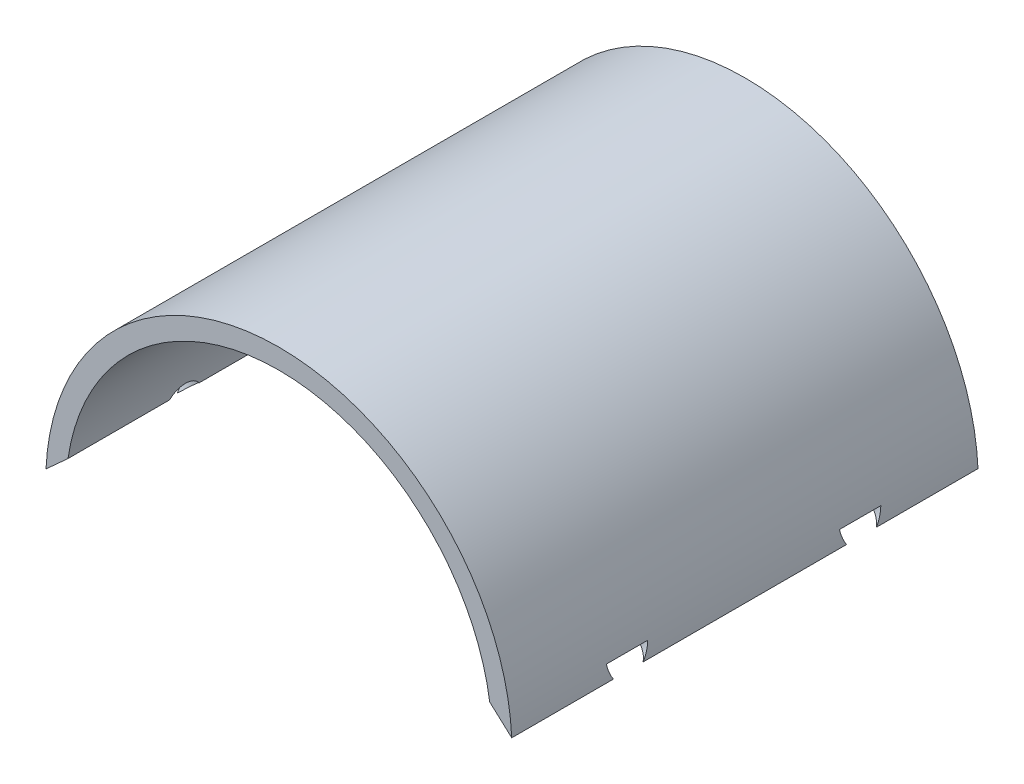
ISO-10303-21;
HEADER;
FILE_DESCRIPTION(('STEP AP214'),'2;1');
FILE_NAME('part.step','',(''),(''),'','','');
FILE_SCHEMA(('AUTOMOTIVE_DESIGN { 1 0 10303 214 1 1 1 1 }'));
ENDSEC;
DATA;
#1=APPLICATION_CONTEXT('core data for automotive mechanical design processes');
#2=APPLICATION_PROTOCOL_DEFINITION('international standard','automotive_design',2000,#1);
#3=PRODUCT_CONTEXT('',#1,'mechanical');
#4=PRODUCT('Part','Part','',(#3));
#5=PRODUCT_RELATED_PRODUCT_CATEGORY('part','',(#4));
#6=PRODUCT_DEFINITION_FORMATION('','',#4);
#7=PRODUCT_DEFINITION_CONTEXT('part definition',#1,'design');
#8=PRODUCT_DEFINITION('design','',#6,#7);
#9=PRODUCT_DEFINITION_SHAPE('','',#8);
#10=(LENGTH_UNIT() NAMED_UNIT(*) SI_UNIT(.MILLI.,.METRE.));
#11=(NAMED_UNIT(*) PLANE_ANGLE_UNIT() SI_UNIT($,.RADIAN.));
#12=(NAMED_UNIT(*) SI_UNIT($,.STERADIAN.) SOLID_ANGLE_UNIT());
#13=UNCERTAINTY_MEASURE_WITH_UNIT(LENGTH_MEASURE(1.E-05),#10,'distance_accuracy_value','');
#14=(GEOMETRIC_REPRESENTATION_CONTEXT(3) GLOBAL_UNCERTAINTY_ASSIGNED_CONTEXT((#13)) GLOBAL_UNIT_ASSIGNED_CONTEXT((#10,
#11,#12)) REPRESENTATION_CONTEXT('',''));
#15=CARTESIAN_POINT('',(0.,0.,0.));
#16=DIRECTION('',(0.,0.,1.));
#17=DIRECTION('',(1.,0.,0.));
#18=AXIS2_PLACEMENT_3D('',#15,#16,#17);
#19=CARTESIAN_POINT('',(40.2038837694651,5.93778829627168,88.9));
#20=DIRECTION('',(0.672307408747508,0.740272077106257,0.));
#21=DIRECTION('',(-0.740272077106257,0.672307408747508,0.));
#22=AXIS2_PLACEMENT_3D('',#19,#20,#21);
#23=PLANE('',#22);
#24=DIRECTION('',(0.,0.,-1.));
#25=VECTOR('',#24,1.);
#26=CARTESIAN_POINT('',(40.2038837694651,5.93778829627168,88.9));
#27=LINE('',#26,#25);
#28=CARTESIAN_POINT('',(40.2038837694651,5.93778829627168,63.8516801787405));
#29=VERTEX_POINT('',#28);
#30=CARTESIAN_POINT('',(40.2038837694651,5.93778829627168,25.0483198212595));
#31=VERTEX_POINT('',#30);
#32=EDGE_CURVE('E176',#29,#31,#27,.T.);
#33=ORIENTED_EDGE('',*,*,#32,.T.);
#34=CARTESIAN_POINT('',(42.3014633715025,4.03278829627168,22.225));
#35=DIRECTION('',(-0.672307408747508,-0.740272077106257,0.));
#36=DIRECTION('',(-0.740272077106257,0.672307408747508,0.));
#37=AXIS2_PLACEMENT_3D('',#34,#35,#36);
#38=CIRCLE('',#37,4.00000000000002);
#39=CARTESIAN_POINT('',(44.39904297354,2.12778829627168,25.0483198212595));
#40=VERTEX_POINT('',#39);
#41=EDGE_CURVE('E158',#40,#31,#38,.T.);
#42=ORIENTED_EDGE('',*,*,#41,.F.);
#43=DIRECTION('',(0.,0.,-1.));
#44=VECTOR('',#43,1.);
#45=CARTESIAN_POINT('',(44.39904297354,2.12778829627168,88.9));
#46=LINE('',#45,#44);
#47=CARTESIAN_POINT('',(44.39904297354,2.12778829627168,63.8516801787405));
#48=VERTEX_POINT('',#47);
#49=EDGE_CURVE('E181',#48,#40,#46,.T.);
#50=ORIENTED_EDGE('',*,*,#49,.F.);
#51=CARTESIAN_POINT('',(42.3014633715025,4.03278829627168,66.675));
#52=DIRECTION('',(-0.672307408747508,-0.740272077106257,0.));
#53=DIRECTION('',(0.740272077106257,-0.672307408747508,0.));
#54=AXIS2_PLACEMENT_3D('',#51,#52,#53);
#55=CIRCLE('',#54,4.00000000000002);
#56=EDGE_CURVE('E163',#29,#48,#55,.T.);
#57=ORIENTED_EDGE('',*,*,#56,.F.);
#58=EDGE_LOOP('',(#33,#42,#50,#57));
#59=FACE_BOUND('',#58,.T.);
#60=ADVANCED_FACE('F35',(#59),#23,.F.);
#61=CARTESIAN_POINT('',(40.2038837694651,5.93778829627168,88.9));
#62=VERTEX_POINT('',#61);
#63=CARTESIAN_POINT('',(40.2038837694651,5.93778829627168,69.4983198212595));
#64=VERTEX_POINT('',#63);
#65=EDGE_CURVE('E179',#62,#64,#27,.T.);
#66=ORIENTED_EDGE('',*,*,#65,.T.);
#67=CARTESIAN_POINT('',(44.39904297354,2.12778829627168,69.4983198212595));
#68=VERTEX_POINT('',#67);
#69=EDGE_CURVE('E241',#68,#64,#55,.T.);
#70=ORIENTED_EDGE('',*,*,#69,.F.);
#71=CARTESIAN_POINT('',(44.39904297354,2.12778829627168,88.9));
#72=VERTEX_POINT('',#71);
#73=EDGE_CURVE('E177',#72,#68,#46,.T.);
#74=ORIENTED_EDGE('',*,*,#73,.F.);
#75=DIRECTION('',(0.740272077106257,-0.672307408747507,0.));
#76=VECTOR('',#75,1.);
#77=CARTESIAN_POINT('',(40.2038837694651,5.93778829627168,88.9));
#78=LINE('',#77,#76);
#79=EDGE_CURVE('E306',#62,#72,#78,.T.);
#80=ORIENTED_EDGE('',*,*,#79,.F.);
#81=EDGE_LOOP('',(#66,#70,#74,#80));
#82=FACE_BOUND('',#81,.T.);
#83=ADVANCED_FACE('F353',(#82),#23,.F.);
#84=CARTESIAN_POINT('',(-40.2038837694651,5.93778829627168,88.9));
#85=DIRECTION('',(-0.672307408747508,0.740272077106257,0.));
#86=DIRECTION('',(-0.740272077106257,-0.672307408747508,0.));
#87=AXIS2_PLACEMENT_3D('',#84,#85,#86);
#88=PLANE('',#87);
#89=DIRECTION('',(0.,0.,-1.));
#90=VECTOR('',#89,1.);
#91=CARTESIAN_POINT('',(-44.39904297354,2.12778829627168,88.9));
#92=LINE('',#91,#90);
#93=CARTESIAN_POINT('',(-44.39904297354,2.12778829627168,63.9039892151859));
#94=VERTEX_POINT('',#93);
#95=CARTESIAN_POINT('',(-44.39904297354,2.12778829627168,24.9960107848141));
#96=VERTEX_POINT('',#95);
#97=EDGE_CURVE('E329',#94,#96,#92,.T.);
#98=ORIENTED_EDGE('',*,*,#97,.T.);
#99=CARTESIAN_POINT('',(-42.3014633715025,4.03278829627168,22.1726909635546));
#100=DIRECTION('',(-0.672307408747508,0.740272077106257,0.));
#101=DIRECTION('',(-0.740272077106257,-0.672307408747508,0.));
#102=AXIS2_PLACEMENT_3D('',#99,#100,#101);
#103=CIRCLE('',#102,4.);
#104=CARTESIAN_POINT('',(-40.2038837694651,5.93778829627168,24.9960107848141));
#105=VERTEX_POINT('',#104);
#106=EDGE_CURVE('E195',#96,#105,#103,.T.);
#107=ORIENTED_EDGE('',*,*,#106,.T.);
#108=DIRECTION('',(0.,0.,-1.));
#109=VECTOR('',#108,1.);
#110=CARTESIAN_POINT('',(-40.2038837694651,5.93778829627168,88.9));
#111=LINE('',#110,#109);
#112=CARTESIAN_POINT('',(-40.2038837694651,5.93778829627168,63.9039892151859));
#113=VERTEX_POINT('',#112);
#114=EDGE_CURVE('E326',#113,#105,#111,.T.);
#115=ORIENTED_EDGE('',*,*,#114,.F.);
#116=CARTESIAN_POINT('',(-42.3014633715025,4.03278829627168,66.7273090364454));
#117=DIRECTION('',(-0.672307408747508,0.740272077106257,0.));
#118=DIRECTION('',(-0.740272077106257,-0.672307408747508,0.));
#119=AXIS2_PLACEMENT_3D('',#116,#117,#118);
#120=CIRCLE('',#119,4.);
#121=EDGE_CURVE('E185',#113,#94,#120,.T.);
#122=ORIENTED_EDGE('',*,*,#121,.T.);
#123=EDGE_LOOP('',(#98,#107,#115,#122));
#124=FACE_BOUND('',#123,.T.);
#125=ADVANCED_FACE('F358',(#124),#88,.F.);
#126=CARTESIAN_POINT('',(-44.39904297354,2.12778829627168,88.9));
#127=VERTEX_POINT('',#126);
#128=CARTESIAN_POINT('',(-44.39904297354,2.12778829627168,69.5506288577048));
#129=VERTEX_POINT('',#128);
#130=EDGE_CURVE('E327',#127,#129,#92,.T.);
#131=ORIENTED_EDGE('',*,*,#130,.T.);
#132=CARTESIAN_POINT('',(-42.3014633715025,4.03278829627168,66.7273090364454));
#133=DIRECTION('',(0.672307408747508,-0.740272077106257,0.));
#134=DIRECTION('',(0.740272077106257,0.672307408747508,0.));
#135=AXIS2_PLACEMENT_3D('',#132,#133,#134);
#136=CIRCLE('',#135,4.);
#137=CARTESIAN_POINT('',(-40.2038837694651,5.93778829627168,69.5506288577048));
#138=VERTEX_POINT('',#137);
#139=EDGE_CURVE('E272',#138,#129,#136,.T.);
#140=ORIENTED_EDGE('',*,*,#139,.F.);
#141=CARTESIAN_POINT('',(-40.2038837694651,5.93778829627168,88.9));
#142=VERTEX_POINT('',#141);
#143=EDGE_CURVE('E322',#142,#138,#111,.T.);
#144=ORIENTED_EDGE('',*,*,#143,.F.);
#145=DIRECTION('',(0.740272077106257,0.672307408747507,0.));
#146=VECTOR('',#145,1.);
#147=CARTESIAN_POINT('',(-40.2038837694651,5.93778829627168,88.9));
#148=LINE('',#147,#146);
#149=EDGE_CURVE('E311',#127,#142,#148,.T.);
#150=ORIENTED_EDGE('',*,*,#149,.F.);
#151=EDGE_LOOP('',(#131,#140,#144,#150));
#152=FACE_BOUND('',#151,.T.);
#153=ADVANCED_FACE('F364',(#152),#88,.F.);
#154=CARTESIAN_POINT('',(0.,0.,88.9));
#155=DIRECTION('',(0.,0.,-1.));
#156=DIRECTION('',(-1.,0.,0.));
#157=AXIS2_PLACEMENT_3D('',#154,#155,#156);
#158=CYLINDRICAL_SURFACE('',#157,40.64);
#159=CARTESIAN_POINT('',(40.2038837694651,5.93778829627168,19.4016801787405));
#160=VERTEX_POINT('',#159);
#161=CARTESIAN_POINT('',(40.2038837694651,5.93778829627168,0.));
#162=VERTEX_POINT('',#161);
#163=EDGE_CURVE('E169',#160,#162,#27,.T.);
#164=ORIENTED_EDGE('',*,*,#163,.F.);
#165=CARTESIAN_POINT('',(40.2038837694651,5.93778829627168,19.4016801787405));
#166=CARTESIAN_POINT('',(40.1913132421633,6.02291585990194,19.468451012384));
#167=CARTESIAN_POINT('',(40.1788118055654,6.10567612462734,19.5383090284334));
#168=CARTESIAN_POINT('',(40.1541531544196,6.26578865022538,19.6841564919255));
#169=CARTESIAN_POINT('',(40.141996254572,6.34313605606763,19.7601513154342));
#170=CARTESIAN_POINT('',(40.1181724615959,6.49211688683358,19.9186650040298));
#171=CARTESIAN_POINT('',(40.1065096054522,6.56370640806694,20.0012259066478));
#172=CARTESIAN_POINT('',(40.084010278307,6.69973661307581,20.1721383550985));
#173=CARTESIAN_POINT('',(40.0731736749685,6.76417844241918,20.2604889693869));
#174=CARTESIAN_POINT('',(40.0525137129598,6.88545967671023,20.4431581372088));
#175=CARTESIAN_POINT('',(40.0426967734591,6.94225151658456,20.5375091010737));
#176=CARTESIAN_POINT('',(40.0244097045485,7.04691787405929,20.7311039358884));
#177=CARTESIAN_POINT('',(40.0159388212325,7.09479738591596,20.8303450268524));
#178=CARTESIAN_POINT('',(40.0005991194072,7.18077811889623,21.0327622636441));
#179=CARTESIAN_POINT('',(39.9937256904317,7.21890751291721,21.1359260593821));
#180=CARTESIAN_POINT('',(39.9817585070471,7.28489638060097,21.3455846116719));
#181=CARTESIAN_POINT('',(39.9766644580635,7.31275755419963,21.4520788136948));
#182=CARTESIAN_POINT('',(39.9688951209998,7.3550954287587,21.6549319276881));
#183=CARTESIAN_POINT('',(39.9660082465001,7.37074734269621,21.751038760085));
#184=CARTESIAN_POINT('',(39.9618273423075,7.39338141912511,21.9442982070598));
#185=CARTESIAN_POINT('',(39.9605331676218,7.40036437080399,22.0414507256303));
#186=CARTESIAN_POINT('',(39.959572741404,7.40554902528821,22.2360426896164));
#187=CARTESIAN_POINT('',(39.9599071437956,7.4037472007363,22.3334822345852));
#188=CARTESIAN_POINT('',(39.9621931505267,7.39139675083092,22.5277577855384));
#189=CARTESIAN_POINT('',(39.9641446988048,7.3808484286908,22.6245938123276));
#190=CARTESIAN_POINT('',(39.9719414920248,7.33855241593989,22.8983064206819));
#191=CARTESIAN_POINT('',(39.9796837595757,7.29642130763879,23.0736312666679));
#192=CARTESIAN_POINT('',(39.999871326816,7.18491731329966,23.4148936292307));
#193=CARTESIAN_POINT('',(40.0123158095611,7.11554915923653,23.5808327706885));
#194=CARTESIAN_POINT('',(40.0415424936381,6.94923599022486,23.9068167729333));
#195=CARTESIAN_POINT('',(40.0584870977926,6.85124076692096,24.0663081757797));
#196=CARTESIAN_POINT('',(40.095192960951,6.63304538763831,24.3689532611373));
#197=CARTESIAN_POINT('',(40.1149555090133,6.51283506194859,24.5120994123058));
#198=CARTESIAN_POINT('',(40.1465702815048,6.31406979300915,24.7186060183779));
#199=CARTESIAN_POINT('',(40.1578673895727,6.24187114155978,24.7883169061829));
#200=CARTESIAN_POINT('',(40.1807169493678,6.09304946759938,24.9223146031002));
#201=CARTESIAN_POINT('',(40.1922684964993,6.01644092130682,24.9866176253914));
#202=CARTESIAN_POINT('',(40.2038837694651,5.93778829627168,25.0483198212595));
#203=B_SPLINE_CURVE_WITH_KNOTS('',3,(#165,#166,#167,#168,#169,#170,#171,#172,#173,#174,#175,
#176,#177,#178,#179,#180,#181,#182,#183,#184,#185,#186,#187,#188,#189,#190,#191,#192,#193,#194,
#195,#196,#197,#198,#199,#200,#201,#202),.UNSPECIFIED.,.F.,.F.,(4,2,2,2,2,2,2,2,2,2,2,2,2,2,2,2,
2,2,4),(0.,0.326735220214414,0.653759843865197,0.983079210473244,1.312345720231,
1.64357330309618,1.97461471142325,2.30468848457326,2.63470758840894,2.92656284759356,
3.21839153549948,3.51033741122768,3.80227316654106,4.34104349743154,4.87972026749843,
5.4413775079196,6.00329250565088,6.30606558674257,6.60789591837461),.UNSPECIFIED.);
#204=EDGE_CURVE('E153',#160,#31,#203,.T.);
#205=ORIENTED_EDGE('',*,*,#204,.T.);
#206=ORIENTED_EDGE('',*,*,#32,.F.);
#207=CARTESIAN_POINT('',(40.2038837694651,5.93778829627168,63.8516801787405));
#208=CARTESIAN_POINT('',(40.1913132421633,6.02291585990194,63.918451012384));
#209=CARTESIAN_POINT('',(40.1788118055654,6.10567612462734,63.9883090284334));
#210=CARTESIAN_POINT('',(40.1541531544196,6.26578865022537,64.1341564919255));
#211=CARTESIAN_POINT('',(40.141996254572,6.34313605606762,64.2101513154342));
#212=CARTESIAN_POINT('',(40.1181724615959,6.49211688683357,64.3686650040298));
#213=CARTESIAN_POINT('',(40.1065096054522,6.56370640806694,64.4512259066478));
#214=CARTESIAN_POINT('',(40.084010278307,6.69973661307581,64.6221383550985));
#215=CARTESIAN_POINT('',(40.0731736749685,6.76417844241919,64.7104889693869));
#216=CARTESIAN_POINT('',(40.0525137129598,6.88545967671023,64.8931581372088));
#217=CARTESIAN_POINT('',(40.0426967734591,6.94225151658456,64.9875091010737));
#218=CARTESIAN_POINT('',(40.0244097045485,7.04691787405928,65.1811039358884));
#219=CARTESIAN_POINT('',(40.0159388212325,7.09479738591596,65.2803450268524));
#220=CARTESIAN_POINT('',(40.0005991194072,7.18077811889623,65.4827622636441));
#221=CARTESIAN_POINT('',(39.9937256904317,7.21890751291721,65.5859260593821));
#222=CARTESIAN_POINT('',(39.9817585070471,7.28489638060096,65.7955846116719));
#223=CARTESIAN_POINT('',(39.9766644580635,7.31275755419963,65.9020788136948));
#224=CARTESIAN_POINT('',(39.9688951209998,7.3550954287587,66.1049319276881));
#225=CARTESIAN_POINT('',(39.9660082465001,7.37074734269622,66.201038760085));
#226=CARTESIAN_POINT('',(39.9618273423075,7.39338141912512,66.3942982070598));
#227=CARTESIAN_POINT('',(39.9605331676218,7.40036437080399,66.4914507256303));
#228=CARTESIAN_POINT('',(39.959572741404,7.40554902528821,66.6860426896164));
#229=CARTESIAN_POINT('',(39.9599071437956,7.4037472007363,66.7834822345852));
#230=CARTESIAN_POINT('',(39.9621931505267,7.39139675083092,66.9777577855384));
#231=CARTESIAN_POINT('',(39.9641446988048,7.38084842869079,67.0745938123277));
#232=CARTESIAN_POINT('',(39.9719414920248,7.33855241593988,67.3483064206819));
#233=CARTESIAN_POINT('',(39.9796837595757,7.29642130763878,67.523631266668));
#234=CARTESIAN_POINT('',(39.999871326816,7.18491731329965,67.8648936292307));
#235=CARTESIAN_POINT('',(40.0123158095611,7.11554915923653,68.0308327706885));
#236=CARTESIAN_POINT('',(40.0415424936381,6.94923599022486,68.3568167729333));
#237=CARTESIAN_POINT('',(40.0584870977926,6.85124076692096,68.5163081757797));
#238=CARTESIAN_POINT('',(40.095192960951,6.6330453876383,68.8189532611374));
#239=CARTESIAN_POINT('',(40.1149555090133,6.51283506194858,68.9620994123058));
#240=CARTESIAN_POINT('',(40.1465702815048,6.31406979300913,69.1686060183779));
#241=CARTESIAN_POINT('',(40.1578673895727,6.24187114155976,69.2383169061829));
#242=CARTESIAN_POINT('',(40.1807169493678,6.09304946759937,69.3723146031002));
#243=CARTESIAN_POINT('',(40.1922684964993,6.01644092130681,69.4366176253914));
#244=CARTESIAN_POINT('',(40.2038837694651,5.93778829627167,69.4983198212595));
#245=B_SPLINE_CURVE_WITH_KNOTS('',3,(#207,#208,#209,#210,#211,#212,#213,#214,#215,#216,#217,
#218,#219,#220,#221,#222,#223,#224,#225,#226,#227,#228,#229,#230,#231,#232,#233,#234,#235,#236,
#237,#238,#239,#240,#241,#242,#243,#244),.UNSPECIFIED.,.F.,.F.,(4,2,2,2,2,2,2,2,2,2,2,2,2,2,2,2,
2,2,4),(0.,0.326735220214408,0.653759843865195,0.983079210473237,1.312345720231,
1.64357330309617,1.97461471142324,2.30468848457324,2.63470758840896,2.92656284759356,
3.21839153549949,3.51033741122769,3.80227316654107,4.34104349743155,4.87972026749843,
5.4413775079196,6.0032925056509,6.30606558674258,6.60789591837461),.UNSPECIFIED.);
#246=EDGE_CURVE('E233',#29,#64,#245,.T.);
#247=ORIENTED_EDGE('',*,*,#246,.T.);
#248=ORIENTED_EDGE('',*,*,#65,.F.);
#249=CARTESIAN_POINT('',(0.,0.,88.9));
#250=DIRECTION('',(0.,0.,-1.));
#251=DIRECTION('',(1.,0.,0.));
#252=AXIS2_PLACEMENT_3D('',#249,#250,#251);
#253=CIRCLE('',#252,40.64);
#254=EDGE_CURVE('E303',#142,#62,#253,.T.);
#255=ORIENTED_EDGE('',*,*,#254,.F.);
#256=ORIENTED_EDGE('',*,*,#143,.T.);
#257=CARTESIAN_POINT('',(-40.2038837694651,5.93778829627166,69.5506288577048));
#258=CARTESIAN_POINT('',(-40.1913132421633,6.02291585990194,69.4838580240613));
#259=CARTESIAN_POINT('',(-40.1788118055654,6.10567612462734,69.4140000080119));
#260=CARTESIAN_POINT('',(-40.1541531544196,6.26578865022537,69.2681525445199));
#261=CARTESIAN_POINT('',(-40.141996254572,6.34313605606761,69.1921577210112));
#262=CARTESIAN_POINT('',(-40.1181724615959,6.49211688683356,69.0336440324156));
#263=CARTESIAN_POINT('',(-40.1065096054522,6.56370640806692,68.9510831297976));
#264=CARTESIAN_POINT('',(-40.084010278307,6.69973661307579,68.7801706813469));
#265=CARTESIAN_POINT('',(-40.0731736749685,6.76417844241917,68.6918200670584));
#266=CARTESIAN_POINT('',(-40.0525137129598,6.88545967671022,68.5091508992366));
#267=CARTESIAN_POINT('',(-40.0426967734591,6.94225151658455,68.4147999353717));
#268=CARTESIAN_POINT('',(-40.0244097045485,7.04691787405928,68.221205100557));
#269=CARTESIAN_POINT('',(-40.0159388212325,7.09479738591595,68.121964009593));
#270=CARTESIAN_POINT('',(-40.0005991194072,7.18077811889622,67.9195467728013));
#271=CARTESIAN_POINT('',(-39.9937256904317,7.2189075129172,67.8163829770633));
#272=CARTESIAN_POINT('',(-39.9817585070471,7.28489638060095,67.6067244247735));
#273=CARTESIAN_POINT('',(-39.9766644580635,7.31275755419961,67.5002302227506));
#274=CARTESIAN_POINT('',(-39.9688951209998,7.35509542875868,67.2973771087573));
#275=CARTESIAN_POINT('',(-39.9660082465001,7.3707473426962,67.2012702763604));
#276=CARTESIAN_POINT('',(-39.9618273423075,7.3933814191251,67.0080108293856));
#277=CARTESIAN_POINT('',(-39.9605331676218,7.40036437080397,66.9108583108151));
#278=CARTESIAN_POINT('',(-39.959572741404,7.40554902528819,66.716266346829));
#279=CARTESIAN_POINT('',(-39.9599071437956,7.40374720073629,66.6188268018602));
#280=CARTESIAN_POINT('',(-39.9621931505267,7.39139675083091,66.424551250907));
#281=CARTESIAN_POINT('',(-39.9641446988048,7.38084842869078,66.3277152241177));
#282=CARTESIAN_POINT('',(-39.9719414920248,7.33855241593987,66.0540026157635));
#283=CARTESIAN_POINT('',(-39.9796837595757,7.29642130763877,65.8786777697774));
#284=CARTESIAN_POINT('',(-39.999871326816,7.18491731329965,65.5374154072147));
#285=CARTESIAN_POINT('',(-40.0123158095611,7.11554915923653,65.3714762657569));
#286=CARTESIAN_POINT('',(-40.0415424936381,6.94923599022486,65.0454922635121));
#287=CARTESIAN_POINT('',(-40.0584870977926,6.85124076692097,64.8860008606657));
#288=CARTESIAN_POINT('',(-40.095192960951,6.63304538763831,64.583355775308));
#289=CARTESIAN_POINT('',(-40.1149555090133,6.51283506194859,64.4402096241396));
#290=CARTESIAN_POINT('',(-40.1465702815048,6.31406979300914,64.2337030180675));
#291=CARTESIAN_POINT('',(-40.1578673895727,6.24187114155978,64.1639921302625));
#292=CARTESIAN_POINT('',(-40.1807169493678,6.09304946759938,64.0299944333452));
#293=CARTESIAN_POINT('',(-40.1922684964993,6.01644092130682,63.965691411054));
#294=CARTESIAN_POINT('',(-40.2038837694651,5.93778829627166,63.9039892151859));
#295=B_SPLINE_CURVE_WITH_KNOTS('',3,(#257,#258,#259,#260,#261,#262,#263,#264,#265,#266,#267,
#268,#269,#270,#271,#272,#273,#274,#275,#276,#277,#278,#279,#280,#281,#282,#283,#284,#285,#286,
#287,#288,#289,#290,#291,#292,#293,#294),.UNSPECIFIED.,.F.,.F.,(4,2,2,2,2,2,2,2,2,2,2,2,2,2,2,2,
2,2,4),(0.,0.326735220214416,0.653759843865198,0.98307921047324,1.31234572023099,
1.64357330309618,1.97461471142324,2.30468848457323,2.63470758840892,2.92656284759353,
3.21839153549945,3.51033741122765,3.80227316654103,4.34104349743152,4.87972026749839,
5.44137750791956,6.00329250565084,6.30606558674255,6.60789591837459),.UNSPECIFIED.);
#296=EDGE_CURVE('E297',#138,#113,#295,.T.);
#297=ORIENTED_EDGE('',*,*,#296,.T.);
#298=ORIENTED_EDGE('',*,*,#114,.T.);
#299=CARTESIAN_POINT('',(-40.2038837694651,5.93778829627167,24.9960107848141));
#300=CARTESIAN_POINT('',(-40.1913132421633,6.02291585990193,24.9292399511706));
#301=CARTESIAN_POINT('',(-40.1788118055654,6.10567612462733,24.8593819351212));
#302=CARTESIAN_POINT('',(-40.1541531544196,6.26578865022536,24.7135344716291));
#303=CARTESIAN_POINT('',(-40.141996254572,6.34313605606761,24.6375396481204));
#304=CARTESIAN_POINT('',(-40.1181724615959,6.49211688683356,24.4790259595248));
#305=CARTESIAN_POINT('',(-40.1065096054522,6.56370640806693,24.3964650569068));
#306=CARTESIAN_POINT('',(-40.084010278307,6.6997366130758,24.2255526084561));
#307=CARTESIAN_POINT('',(-40.0731736749685,6.76417844241917,24.1372019941677));
#308=CARTESIAN_POINT('',(-40.0525137129598,6.88545967671022,23.9545328263458));
#309=CARTESIAN_POINT('',(-40.0426967734591,6.94225151658455,23.860181862481));
#310=CARTESIAN_POINT('',(-40.0244097045485,7.04691787405927,23.6665870276663));
#311=CARTESIAN_POINT('',(-40.0159388212325,7.09479738591595,23.5673459367022));
#312=CARTESIAN_POINT('',(-40.0005991194072,7.18077811889622,23.3649286999105));
#313=CARTESIAN_POINT('',(-39.9937256904317,7.2189075129172,23.2617649041725));
#314=CARTESIAN_POINT('',(-39.9817585070471,7.28489638060095,23.0521063518827));
#315=CARTESIAN_POINT('',(-39.9766644580635,7.31275755419961,22.9456121498598));
#316=CARTESIAN_POINT('',(-39.9688951209998,7.35509542875868,22.7427590358665));
#317=CARTESIAN_POINT('',(-39.9660082465001,7.3707473426962,22.6466522034696));
#318=CARTESIAN_POINT('',(-39.9618273423075,7.3933814191251,22.4533927564949));
#319=CARTESIAN_POINT('',(-39.9605331676218,7.40036437080397,22.3562402379243));
#320=CARTESIAN_POINT('',(-39.959572741404,7.40554902528819,22.1616482739382));
#321=CARTESIAN_POINT('',(-39.9599071437956,7.40374720073629,22.0642087289694));
#322=CARTESIAN_POINT('',(-39.9621931505267,7.39139675083091,21.8699331780162));
#323=CARTESIAN_POINT('',(-39.9641446988048,7.38084842869078,21.773097151227));
#324=CARTESIAN_POINT('',(-39.9719414920248,7.33855241593987,21.4993845428728));
#325=CARTESIAN_POINT('',(-39.9796837595757,7.29642130763877,21.3240596968867));
#326=CARTESIAN_POINT('',(-39.999871326816,7.18491731329965,20.9827973343239));
#327=CARTESIAN_POINT('',(-40.0123158095611,7.11554915923652,20.8168581928662));
#328=CARTESIAN_POINT('',(-40.0415424936381,6.94923599022484,20.4908741906213));
#329=CARTESIAN_POINT('',(-40.0584870977926,6.85124076692095,20.3313827877749));
#330=CARTESIAN_POINT('',(-40.095192960951,6.6330453876383,20.0287377024173));
#331=CARTESIAN_POINT('',(-40.1149555090133,6.51283506194858,19.8855915512489));
#332=CARTESIAN_POINT('',(-40.1465702815048,6.31406979300913,19.6790849451767));
#333=CARTESIAN_POINT('',(-40.1578673895727,6.24187114155977,19.6093740573717));
#334=CARTESIAN_POINT('',(-40.1807169493678,6.09304946759937,19.4753763604544));
#335=CARTESIAN_POINT('',(-40.1922684964993,6.01644092130681,19.4110733381632));
#336=CARTESIAN_POINT('',(-40.2038837694651,5.93778829627166,19.3493711422952));
#337=B_SPLINE_CURVE_WITH_KNOTS('',3,(#299,#300,#301,#302,#303,#304,#305,#306,#307,#308,#309,
#310,#311,#312,#313,#314,#315,#316,#317,#318,#319,#320,#321,#322,#323,#324,#325,#326,#327,#328,
#329,#330,#331,#332,#333,#334,#335,#336),.UNSPECIFIED.,.F.,.F.,(4,2,2,2,2,2,2,2,2,2,2,2,2,2,2,2,
2,2,4),(0.,0.326735220214417,0.653759843865197,0.983079210473244,1.312345720231,
1.64357330309617,1.97461471142325,2.30468848457325,2.63470758840894,2.92656284759354,
3.21839153549947,3.51033741122767,3.80227316654105,4.34104349743153,4.87972026749841,
5.44137750791958,6.00329250565085,6.30606558674255,6.6078959183746),.UNSPECIFIED.);
#338=CARTESIAN_POINT('',(-40.2038837694651,5.93778829627168,19.3493711422952));
#339=VERTEX_POINT('',#338);
#340=EDGE_CURVE('E266',#105,#339,#337,.T.);
#341=ORIENTED_EDGE('',*,*,#340,.T.);
#342=CARTESIAN_POINT('',(-40.2038837694651,5.93778829627168,0.));
#343=VERTEX_POINT('',#342);
#344=EDGE_CURVE('E313',#339,#343,#111,.T.);
#345=ORIENTED_EDGE('',*,*,#344,.T.);
#346=CARTESIAN_POINT('',(0.,0.,0.));
#347=DIRECTION('',(0.,0.,-1.));
#348=DIRECTION('',(1.,0.,0.));
#349=AXIS2_PLACEMENT_3D('',#346,#347,#348);
#350=CIRCLE('',#349,40.64);
#351=EDGE_CURVE('E175',#343,#162,#350,.T.);
#352=ORIENTED_EDGE('',*,*,#351,.T.);
#353=EDGE_LOOP('',(#164,#205,#206,#247,#248,#255,#256,#297,#298,#341,#345,#352));
#354=FACE_BOUND('',#353,.T.);
#355=ADVANCED_FACE('F37',(#354),#158,.F.);
#356=CARTESIAN_POINT('',(44.39904297354,2.12778829627168,19.4016801787405));
#357=VERTEX_POINT('',#356);
#358=CARTESIAN_POINT('',(44.39904297354,2.12778829627168,0.));
#359=VERTEX_POINT('',#358);
#360=EDGE_CURVE('E171',#357,#359,#46,.T.);
#361=ORIENTED_EDGE('',*,*,#360,.F.);
#362=EDGE_CURVE('E156',#160,#357,#38,.T.);
#363=ORIENTED_EDGE('',*,*,#362,.F.);
#364=ORIENTED_EDGE('',*,*,#163,.T.);
#365=DIRECTION('',(0.740272077106257,-0.672307408747507,0.));
#366=VECTOR('',#365,1.);
#367=CARTESIAN_POINT('',(40.2038837694651,5.93778829627168,0.));
#368=LINE('',#367,#366);
#369=EDGE_CURVE('E315',#162,#359,#368,.T.);
#370=ORIENTED_EDGE('',*,*,#369,.T.);
#371=EDGE_LOOP('',(#361,#363,#364,#370));
#372=FACE_BOUND('',#371,.T.);
#373=ADVANCED_FACE('F167',(#372),#23,.F.);
#374=CARTESIAN_POINT('',(0.,0.,88.9));
#375=DIRECTION('',(0.,0.,-1.));
#376=DIRECTION('',(-1.,0.,0.));
#377=AXIS2_PLACEMENT_3D('',#374,#375,#376);
#378=CYLINDRICAL_SURFACE('',#377,44.45);
#379=DIRECTION('',(0.,0.,-1.));
#380=VECTOR('',#379,1.);
#381=CARTESIAN_POINT('',(44.1628902552898,5.0439691017319,88.9));
#382=LINE('',#381,#380);
#383=CARTESIAN_POINT('',(44.1628902552898,5.0439691017319,26.1636042369071));
#384=VERTEX_POINT('',#383);
#385=CARTESIAN_POINT('',(44.1628902552898,5.0439691017319,18.2863957630929));
#386=VERTEX_POINT('',#385);
#387=EDGE_CURVE('E467',#384,#386,#382,.T.);
#388=ORIENTED_EDGE('',*,*,#387,.T.);
#389=CARTESIAN_POINT('',(44.1628902552898,5.0439691017319,18.2863957630928));
#390=CARTESIAN_POINT('',(44.1820882207202,4.87594230518133,18.3089589502951));
#391=CARTESIAN_POINT('',(44.2002218425883,4.70860522803788,18.3376143365309));
#392=CARTESIAN_POINT('',(44.2343731536034,4.37612964124248,18.4070658009129));
#393=CARTESIAN_POINT('',(44.2503893669069,4.21099273646198,18.447870283281));
#394=CARTESIAN_POINT('',(44.2800115624876,3.88703907732059,18.5406662679598));
#395=CARTESIAN_POINT('',(44.2936571173332,3.72816187528309,18.5924335879432));
#396=CARTESIAN_POINT('',(44.3189313479414,3.41460828009221,18.7076300748707));
#397=CARTESIAN_POINT('',(44.330560895291,3.25993009608054,18.7710541776434));
#398=CARTESIAN_POINT('',(44.3531677738895,2.93737590671437,18.9181843089747));
#399=CARTESIAN_POINT('',(44.363895738379,2.77016886967958,19.0034161147886));
#400=CARTESIAN_POINT('',(44.3783028882209,2.52498528170084,19.1432161995369));
#401=CARTESIAN_POINT('',(44.3828439396484,2.44378091214641,19.1920991618397));
#402=CARTESIAN_POINT('',(44.3913614431513,2.28384625817868,19.2938688486936));
#403=CARTESIAN_POINT('',(44.3953376652043,2.20511699183728,19.3467571910389));
#404=CARTESIAN_POINT('',(44.39904297354,2.12778829627168,19.4016801787405));
#405=B_SPLINE_CURVE_WITH_KNOTS('',3,(#389,#390,#391,#392,#393,#394,#395,#396,#397,#398,#399,
#400,#401,#402,#403,#404),.UNSPECIFIED.,.F.,.F.,(4,2,2,2,2,2,2,4),(0.,0.511752184475264,
1.0238592028553,1.52636097799275,2.02864496014023,2.59173143963583,2.87630157654165,
3.16098727221963),.UNSPECIFIED.);
#406=EDGE_CURVE('E11',#386,#357,#405,.T.);
#407=ORIENTED_EDGE('',*,*,#406,.T.);
#408=ORIENTED_EDGE('',*,*,#360,.T.);
#409=CARTESIAN_POINT('',(0.,0.,0.));
#410=DIRECTION('',(0.,0.,1.));
#411=DIRECTION('',(1.,0.,0.));
#412=AXIS2_PLACEMENT_3D('',#409,#410,#411);
#413=CIRCLE('',#412,44.45);
#414=CARTESIAN_POINT('',(-44.39904297354,2.12778829627168,0.));
#415=VERTEX_POINT('',#414);
#416=EDGE_CURVE('E317',#359,#415,#413,.T.);
#417=ORIENTED_EDGE('',*,*,#416,.T.);
#418=CARTESIAN_POINT('',(-44.39904297354,2.12778829627168,19.3493711422952));
#419=VERTEX_POINT('',#418);
#420=EDGE_CURVE('E325',#419,#415,#92,.T.);
#421=ORIENTED_EDGE('',*,*,#420,.F.);
#422=CARTESIAN_POINT('',(-44.39904297354,2.12778829627167,19.3493711422952));
#423=CARTESIAN_POINT('',(-44.3923544121857,2.26755422855094,19.250155847459));
#424=CARTESIAN_POINT('',(-44.3847697444573,2.41182904743818,19.1575401359274));
#425=CARTESIAN_POINT('',(-44.3676992322139,2.70766808373902,18.9852105158601));
#426=CARTESIAN_POINT('',(-44.3582146804163,2.8592272917075,18.9054879009192));
#427=CARTESIAN_POINT('',(-44.3374132457908,3.16535500446611,18.7598200356389));
#428=CARTESIAN_POINT('',(-44.3261319375629,3.31982210178385,18.6936550393621));
#429=CARTESIAN_POINT('',(-44.301552656047,3.63312860846834,18.5731555220595));
#430=CARTESIAN_POINT('',(-44.2882547656636,3.79196783787062,18.5188205149087));
#431=CARTESIAN_POINT('',(-44.258059245395,4.13018844143035,18.4166805041716));
#432=CARTESIAN_POINT('',(-44.2409286505058,4.30994855252607,18.3701972670406));
#433=CARTESIAN_POINT('',(-44.2039449863492,4.67416719068071,18.291273111564));
#434=CARTESIAN_POINT('',(-44.184066246256,4.85865479889098,18.2589782665967));
#435=CARTESIAN_POINT('',(-44.1628902552898,5.0439691017319,18.2340867266475));
#436=B_SPLINE_CURVE_WITH_KNOTS('',3,(#422,#423,#424,#425,#426,#427,#428,#429,#430,#431,#432,
#433,#434,#435),.UNSPECIFIED.,.F.,.F.,(4,2,2,2,2,2,4),(0.,0.51424828929766,1.02814785559117,
1.53291089918042,2.03765319683236,2.59643000698799,3.16083196864486),.UNSPECIFIED.);
#437=CARTESIAN_POINT('',(-44.1628902552898,5.04396910173189,18.2340867266475));
#438=VERTEX_POINT('',#437);
#439=EDGE_CURVE('E246',#419,#438,#436,.T.);
#440=ORIENTED_EDGE('',*,*,#439,.T.);
#441=DIRECTION('',(0.,0.,-1.));
#442=VECTOR('',#441,1.);
#443=CARTESIAN_POINT('',(-44.1628902552898,5.0439691017319,88.9));
#444=LINE('',#443,#442);
#445=CARTESIAN_POINT('',(-44.1628902552898,5.04396910173189,26.1112952004617));
#446=VERTEX_POINT('',#445);
#447=EDGE_CURVE('E200',#438,#446,#444,.F.);
#448=ORIENTED_EDGE('',*,*,#447,.T.);
#449=CARTESIAN_POINT('',(-44.1628902552898,5.0439691017319,26.1112952004617));
#450=CARTESIAN_POINT('',(-44.1820882207202,4.87594230518133,26.0887320132595));
#451=CARTESIAN_POINT('',(-44.2002218425883,4.70860522803788,26.0600766270236));
#452=CARTESIAN_POINT('',(-44.2343731536034,4.37612964124249,25.9906251626417));
#453=CARTESIAN_POINT('',(-44.2503893669069,4.21099273646198,25.9498206802736));
#454=CARTESIAN_POINT('',(-44.2800115624876,3.8870390773206,25.8570246955948));
#455=CARTESIAN_POINT('',(-44.2936571173332,3.7281618752831,25.8052573756114));
#456=CARTESIAN_POINT('',(-44.3189313479414,3.41460828009222,25.6900608886839));
#457=CARTESIAN_POINT('',(-44.330560895291,3.25993009608055,25.6266367859112));
#458=CARTESIAN_POINT('',(-44.3531677738895,2.93737590671438,25.4795066545799));
#459=CARTESIAN_POINT('',(-44.363895738379,2.77016886967958,25.394274848766));
#460=CARTESIAN_POINT('',(-44.3783028882209,2.52498528170084,25.2544747640177));
#461=CARTESIAN_POINT('',(-44.3828439396484,2.44378091214641,25.2055918017148));
#462=CARTESIAN_POINT('',(-44.3913614431513,2.28384625817867,25.103822114861));
#463=CARTESIAN_POINT('',(-44.3953376652043,2.20511699183728,25.0509337725157));
#464=CARTESIAN_POINT('',(-44.39904297354,2.12778829627167,24.9960107848141));
#465=B_SPLINE_CURVE_WITH_KNOTS('',3,(#449,#450,#451,#452,#453,#454,#455,#456,#457,#458,#459,
#460,#461,#462,#463,#464),.UNSPECIFIED.,.F.,.F.,(4,2,2,2,2,2,2,4),(0.,0.511752184475262,
1.02385920285529,1.52636097799274,2.02864496014022,2.59173143963583,2.87630157654166,
3.16098727221965),.UNSPECIFIED.);
#466=EDGE_CURVE('E253',#446,#96,#465,.T.);
#467=ORIENTED_EDGE('',*,*,#466,.T.);
#468=ORIENTED_EDGE('',*,*,#97,.F.);
#469=CARTESIAN_POINT('',(-44.39904297354,2.12778829627168,63.9039892151859));
#470=CARTESIAN_POINT('',(-44.3923544121857,2.26755422855095,63.8047739203498));
#471=CARTESIAN_POINT('',(-44.3847697444573,2.41182904743819,63.7121582088181));
#472=CARTESIAN_POINT('',(-44.3676992322139,2.70766808373903,63.5398285887508));
#473=CARTESIAN_POINT('',(-44.3582146804163,2.85922729170751,63.4601059738099));
#474=CARTESIAN_POINT('',(-44.3374132457908,3.16535500446612,63.3144381085296));
#475=CARTESIAN_POINT('',(-44.3261319375629,3.31982210178385,63.2482731122529));
#476=CARTESIAN_POINT('',(-44.3015526560469,3.63312860846835,63.1277735949502));
#477=CARTESIAN_POINT('',(-44.2882547656636,3.79196783787063,63.0734385877994));
#478=CARTESIAN_POINT('',(-44.258059245395,4.13018844143036,62.9712985770624));
#479=CARTESIAN_POINT('',(-44.2409286505058,4.30994855252608,62.9248153399313));
#480=CARTESIAN_POINT('',(-44.2039449863492,4.6741671906807,62.8458911844547));
#481=CARTESIAN_POINT('',(-44.1840662462561,4.85865479889097,62.8135963394875));
#482=CARTESIAN_POINT('',(-44.1628902552898,5.04396910173189,62.7887047995383));
#483=B_SPLINE_CURVE_WITH_KNOTS('',3,(#469,#470,#471,#472,#473,#474,#475,#476,#477,#478,#479,
#480,#481,#482),.UNSPECIFIED.,.F.,.F.,(4,2,2,2,2,2,4),(0.,0.514248289297657,1.02814785559116,
1.53291089918042,2.03765319683235,2.59643000698798,3.16083196864483),.UNSPECIFIED.);
#484=CARTESIAN_POINT('',(-44.1628902552898,5.04396910173189,62.7887047995383));
#485=VERTEX_POINT('',#484);
#486=EDGE_CURVE('E283',#94,#485,#483,.T.);
#487=ORIENTED_EDGE('',*,*,#486,.T.);
#488=DIRECTION('',(0.,0.,-1.));
#489=VECTOR('',#488,1.);
#490=CARTESIAN_POINT('',(-44.1628902552898,5.0439691017319,88.9));
#491=LINE('',#490,#489);
#492=CARTESIAN_POINT('',(-44.1628902552898,5.04396910173189,70.6659132733525));
#493=VERTEX_POINT('',#492);
#494=EDGE_CURVE('E190',#493,#485,#491,.T.);
#495=ORIENTED_EDGE('',*,*,#494,.F.);
#496=CARTESIAN_POINT('',(-44.1628902552898,5.04396910173189,70.6659132733525));
#497=CARTESIAN_POINT('',(-44.1820882207202,4.87594230518132,70.6433500861503));
#498=CARTESIAN_POINT('',(-44.2002218425883,4.70860522803787,70.6146946999144));
#499=CARTESIAN_POINT('',(-44.2343731536034,4.37612964124248,70.5452432355325));
#500=CARTESIAN_POINT('',(-44.2503893669069,4.21099273646198,70.5044387531644));
#501=CARTESIAN_POINT('',(-44.2800115624876,3.88703907732059,70.4116427684855));
#502=CARTESIAN_POINT('',(-44.2936571173332,3.72816187528309,70.3598754485021));
#503=CARTESIAN_POINT('',(-44.3189313479414,3.41460828009221,70.2446789615746));
#504=CARTESIAN_POINT('',(-44.330560895291,3.25993009608054,70.1812548588019));
#505=CARTESIAN_POINT('',(-44.3531677738895,2.93737590671437,70.0341247274707));
#506=CARTESIAN_POINT('',(-44.363895738379,2.77016886967958,69.9488929216568));
#507=CARTESIAN_POINT('',(-44.3783028882209,2.52498528170084,69.8090928369085));
#508=CARTESIAN_POINT('',(-44.3828439396484,2.44378091214641,69.7602098746056));
#509=CARTESIAN_POINT('',(-44.3913614431513,2.28384625817868,69.6584401877518));
#510=CARTESIAN_POINT('',(-44.3953376652043,2.20511699183728,69.6055518454065));
#511=CARTESIAN_POINT('',(-44.39904297354,2.12778829627168,69.5506288577048));
#512=B_SPLINE_CURVE_WITH_KNOTS('',3,(#496,#497,#498,#499,#500,#501,#502,#503,#504,#505,#506,
#507,#508,#509,#510,#511),.UNSPECIFIED.,.F.,.F.,(4,2,2,2,2,2,2,4),(0.,0.511752184475259,
1.02385920285529,1.52636097799274,2.02864496014022,2.59173143963582,2.87630157654164,
3.16098727221963),.UNSPECIFIED.);
#513=EDGE_CURVE('E276',#493,#129,#512,.T.);
#514=ORIENTED_EDGE('',*,*,#513,.T.);
#515=ORIENTED_EDGE('',*,*,#130,.F.);
#516=CARTESIAN_POINT('',(0.,0.,88.9));
#517=DIRECTION('',(0.,0.,1.));
#518=DIRECTION('',(1.,0.,0.));
#519=AXIS2_PLACEMENT_3D('',#516,#517,#518);
#520=CIRCLE('',#519,44.45);
#521=EDGE_CURVE('E309',#72,#127,#520,.T.);
#522=ORIENTED_EDGE('',*,*,#521,.F.);
#523=ORIENTED_EDGE('',*,*,#73,.T.);
#524=CARTESIAN_POINT('',(44.39904297354,2.12778829627168,69.4983198212595));
#525=CARTESIAN_POINT('',(44.3923544121857,2.26755422855095,69.5975351160956));
#526=CARTESIAN_POINT('',(44.3847697444573,2.41182904743819,69.6901508276273));
#527=CARTESIAN_POINT('',(44.3676992322139,2.70766808373903,69.8624804476946));
#528=CARTESIAN_POINT('',(44.3582146804163,2.85922729170751,69.9422030626355));
#529=CARTESIAN_POINT('',(44.3374132457908,3.16535500446612,70.0878709279158));
#530=CARTESIAN_POINT('',(44.3261319375629,3.31982210178386,70.1540359241925));
#531=CARTESIAN_POINT('',(44.3015526560469,3.63312860846836,70.2745354414951));
#532=CARTESIAN_POINT('',(44.2882547656636,3.79196783787063,70.328870448646));
#533=CARTESIAN_POINT('',(44.258059245395,4.13018844143037,70.431010459383));
#534=CARTESIAN_POINT('',(44.2409286505058,4.30994855252608,70.4774936965141));
#535=CARTESIAN_POINT('',(44.2039449863492,4.67416719068071,70.5564178519907));
#536=CARTESIAN_POINT('',(44.184066246256,4.85865479889099,70.5887126969579));
#537=CARTESIAN_POINT('',(44.1628902552898,5.0439691017319,70.6136042369071));
#538=B_SPLINE_CURVE_WITH_KNOTS('',3,(#524,#525,#526,#527,#528,#529,#530,#531,#532,#533,#534,
#535,#536,#537),.UNSPECIFIED.,.F.,.F.,(4,2,2,2,2,2,4),(0.,0.514248289297659,1.02814785559117,
1.53291089918042,2.03765319683236,2.59643000698799,3.16083196864485),.UNSPECIFIED.);
#539=CARTESIAN_POINT('',(44.1628902552898,5.0439691017319,70.6136042369071));
#540=VERTEX_POINT('',#539);
#541=EDGE_CURVE('E205',#68,#540,#538,.T.);
#542=ORIENTED_EDGE('',*,*,#541,.T.);
#543=DIRECTION('',(0.,0.,-1.));
#544=VECTOR('',#543,1.);
#545=CARTESIAN_POINT('',(44.1628902552898,5.0439691017319,88.9));
#546=LINE('',#545,#544);
#547=CARTESIAN_POINT('',(44.1628902552898,5.0439691017319,62.7363957630929));
#548=VERTEX_POINT('',#547);
#549=EDGE_CURVE('E203',#548,#540,#546,.F.);
#550=ORIENTED_EDGE('',*,*,#549,.F.);
#551=CARTESIAN_POINT('',(44.1628902552898,5.0439691017319,62.7363957630929));
#552=CARTESIAN_POINT('',(44.1820882207202,4.87594230518134,62.7589589502951));
#553=CARTESIAN_POINT('',(44.2002218425883,4.70860522803788,62.787614336531));
#554=CARTESIAN_POINT('',(44.2343731536034,4.37612964124249,62.8570658009129));
#555=CARTESIAN_POINT('',(44.2503893669069,4.21099273646199,62.897870283281));
#556=CARTESIAN_POINT('',(44.2800115624876,3.8870390773206,62.9906662679598));
#557=CARTESIAN_POINT('',(44.2936571173332,3.7281618752831,63.0424335879432));
#558=CARTESIAN_POINT('',(44.3189313479414,3.41460828009222,63.1576300748707));
#559=CARTESIAN_POINT('',(44.330560895291,3.25993009608055,63.2210541776434));
#560=CARTESIAN_POINT('',(44.3531677738895,2.93737590671437,63.3681843089747));
#561=CARTESIAN_POINT('',(44.363895738379,2.77016886967957,63.4534161147886));
#562=CARTESIAN_POINT('',(44.3783028882209,2.52498528170084,63.5932161995369));
#563=CARTESIAN_POINT('',(44.3828439396484,2.44378091214641,63.6420991618397));
#564=CARTESIAN_POINT('',(44.3913614431513,2.28384625817868,63.7438688486936));
#565=CARTESIAN_POINT('',(44.3953376652043,2.20511699183728,63.7967571910389));
#566=CARTESIAN_POINT('',(44.39904297354,2.12778829627167,63.8516801787405));
#567=B_SPLINE_CURVE_WITH_KNOTS('',3,(#551,#552,#553,#554,#555,#556,#557,#558,#559,#560,#561,
#562,#563,#564,#565,#566),.UNSPECIFIED.,.F.,.F.,(4,2,2,2,2,2,2,4),(0.,0.511752184475263,
1.02385920285529,1.52636097799274,2.02864496014023,2.59173143963584,2.87630157654167,
3.16098727221965),.UNSPECIFIED.);
#568=EDGE_CURVE('E212',#548,#48,#567,.T.);
#569=ORIENTED_EDGE('',*,*,#568,.T.);
#570=ORIENTED_EDGE('',*,*,#49,.T.);
#571=CARTESIAN_POINT('',(44.39904297354,2.12778829627168,25.0483198212595));
#572=CARTESIAN_POINT('',(44.3923544121857,2.26755422855095,25.1475351160956));
#573=CARTESIAN_POINT('',(44.3847697444573,2.41182904743819,25.2401508276273));
#574=CARTESIAN_POINT('',(44.3676992322139,2.70766808373903,25.4124804476946));
#575=CARTESIAN_POINT('',(44.3582146804163,2.85922729170751,25.4922030626355));
#576=CARTESIAN_POINT('',(44.3374132457908,3.16535500446613,25.6378709279158));
#577=CARTESIAN_POINT('',(44.3261319375629,3.31982210178387,25.7040359241925));
#578=CARTESIAN_POINT('',(44.3015526560469,3.63312860846837,25.8245354414952));
#579=CARTESIAN_POINT('',(44.2882547656636,3.79196783787065,25.878870448646));
#580=CARTESIAN_POINT('',(44.258059245395,4.13018844143038,25.981010459383));
#581=CARTESIAN_POINT('',(44.2409286505058,4.30994855252609,26.0274936965141));
#582=CARTESIAN_POINT('',(44.2039449863492,4.67416719068072,26.1064178519907));
#583=CARTESIAN_POINT('',(44.184066246256,4.85865479889099,26.1387126969579));
#584=CARTESIAN_POINT('',(44.1628902552898,5.0439691017319,26.1636042369071));
#585=B_SPLINE_CURVE_WITH_KNOTS('',3,(#571,#572,#573,#574,#575,#576,#577,#578,#579,#580,#581,
#582,#583,#584),.UNSPECIFIED.,.F.,.F.,(4,2,2,2,2,2,4),(0.,0.51424828929766,1.02814785559118,
1.53291089918043,2.03765319683237,2.59643000698799,3.16083196864484),.UNSPECIFIED.);
#586=EDGE_CURVE('E49',#40,#384,#585,.T.);
#587=ORIENTED_EDGE('',*,*,#586,.T.);
#588=EDGE_LOOP('',(#388,#407,#408,#417,#421,#440,#448,#467,#468,#487,#495,#514,#515,#522,#523,
#542,#550,#569,#570,#587));
#589=FACE_BOUND('',#588,.T.);
#590=ADVANCED_FACE('F217',(#589),#378,.T.);
#591=ORIENTED_EDGE('',*,*,#344,.F.);
#592=CARTESIAN_POINT('',(-42.3014633715025,4.03278829627168,22.1726909635546));
#593=DIRECTION('',(0.672307408747508,-0.740272077106257,0.));
#594=DIRECTION('',(-0.740272077106257,-0.672307408747508,0.));
#595=AXIS2_PLACEMENT_3D('',#592,#593,#594);
#596=CIRCLE('',#595,4.);
#597=EDGE_CURVE('E240',#419,#339,#596,.T.);
#598=ORIENTED_EDGE('',*,*,#597,.F.);
#599=ORIENTED_EDGE('',*,*,#420,.T.);
#600=DIRECTION('',(0.740272077106257,0.672307408747507,0.));
#601=VECTOR('',#600,1.);
#602=CARTESIAN_POINT('',(-40.2038837694651,5.93778829627168,0.));
#603=LINE('',#602,#601);
#604=EDGE_CURVE('E307',#415,#343,#603,.T.);
#605=ORIENTED_EDGE('',*,*,#604,.T.);
#606=EDGE_LOOP('',(#591,#598,#599,#605));
#607=FACE_BOUND('',#606,.T.);
#608=ADVANCED_FACE('F338',(#607),#88,.F.);
#609=CARTESIAN_POINT('',(0.,0.,88.9));
#610=DIRECTION('',(0.,0.,1.));
#611=DIRECTION('',(1.,0.,0.));
#612=AXIS2_PLACEMENT_3D('',#609,#610,#611);
#613=PLANE('',#612);
#614=ORIENTED_EDGE('',*,*,#254,.T.);
#615=ORIENTED_EDGE('',*,*,#79,.T.);
#616=ORIENTED_EDGE('',*,*,#521,.T.);
#617=ORIENTED_EDGE('',*,*,#149,.T.);
#618=EDGE_LOOP('',(#614,#615,#616,#617));
#619=FACE_BOUND('',#618,.T.);
#620=ADVANCED_FACE('F293',(#619),#613,.T.);
#621=CARTESIAN_POINT('',(0.,0.,0.));
#622=DIRECTION('',(0.,0.,1.));
#623=DIRECTION('',(1.,0.,0.));
#624=AXIS2_PLACEMENT_3D('',#621,#622,#623);
#625=PLANE('',#624);
#626=ORIENTED_EDGE('',*,*,#351,.F.);
#627=ORIENTED_EDGE('',*,*,#604,.F.);
#628=ORIENTED_EDGE('',*,*,#416,.F.);
#629=ORIENTED_EDGE('',*,*,#369,.F.);
#630=EDGE_LOOP('',(#626,#627,#628,#629));
#631=FACE_BOUND('',#630,.T.);
#632=ADVANCED_FACE('F344',(#631),#625,.F.);
#633=CARTESIAN_POINT('',(-43.6460781889975,5.51333245048419,66.7273090364454));
#634=DIRECTION('',(0.672307408747508,-0.740272077106257,0.));
#635=DIRECTION('',(0.740272077106257,0.672307408747508,0.));
#636=AXIS2_PLACEMENT_3D('',#633,#634,#635);
#637=PLANE('',#636);
#638=ORIENTED_EDGE('',*,*,#494,.T.);
#639=CARTESIAN_POINT('',(-43.6460781889975,5.51333245048419,66.7273090364454));
#640=DIRECTION('',(0.672307408747508,-0.740272077106257,0.));
#641=DIRECTION('',(0.740272077106257,0.672307408747508,0.));
#642=AXIS2_PLACEMENT_3D('',#639,#640,#641);
#643=CIRCLE('',#642,4.);
#644=EDGE_CURVE('E273',#485,#493,#643,.T.);
#645=ORIENTED_EDGE('',*,*,#644,.T.);
#646=EDGE_LOOP('',(#638,#645));
#647=FACE_BOUND('',#646,.T.);
#648=ADVANCED_FACE('F262',(#647),#637,.T.);
#649=CARTESIAN_POINT('',(-43.6460781889975,5.51333245048419,66.7273090364454));
#650=DIRECTION('',(0.672307408747508,-0.740272077106257,0.));
#651=DIRECTION('',(0.740272077106257,0.672307408747508,0.));
#652=AXIS2_PLACEMENT_3D('',#649,#650,#651);
#653=CYLINDRICAL_SURFACE('',#652,4.);
#654=ORIENTED_EDGE('',*,*,#139,.T.);
#655=ORIENTED_EDGE('',*,*,#513,.F.);
#656=ORIENTED_EDGE('',*,*,#644,.F.);
#657=ORIENTED_EDGE('',*,*,#486,.F.);
#658=ORIENTED_EDGE('',*,*,#121,.F.);
#659=ORIENTED_EDGE('',*,*,#296,.F.);
#660=EDGE_LOOP('',(#654,#655,#656,#657,#658,#659));
#661=FACE_BOUND('',#660,.T.);
#662=ADVANCED_FACE('F288',(#661),#653,.F.);
#663=CARTESIAN_POINT('',(-43.6460781889975,5.51333245048419,22.1726909635546));
#664=DIRECTION('',(-0.672307408747508,0.740272077106257,0.));
#665=DIRECTION('',(-0.740272077106257,-0.672307408747508,0.));
#666=AXIS2_PLACEMENT_3D('',#663,#664,#665);
#667=PLANE('',#666);
#668=CARTESIAN_POINT('',(-43.6460781889975,5.51333245048419,22.1726909635546));
#669=DIRECTION('',(0.672307408747508,-0.740272077106257,0.));
#670=DIRECTION('',(-0.740272077106257,-0.672307408747508,0.));
#671=AXIS2_PLACEMENT_3D('',#668,#669,#670);
#672=CIRCLE('',#671,4.);
#673=EDGE_CURVE('E243',#438,#446,#672,.T.);
#674=ORIENTED_EDGE('',*,*,#673,.T.);
#675=ORIENTED_EDGE('',*,*,#447,.F.);
#676=EDGE_LOOP('',(#674,#675));
#677=FACE_BOUND('',#676,.T.);
#678=ADVANCED_FACE('F228',(#677),#667,.F.);
#679=CARTESIAN_POINT('',(-43.6460781889975,5.51333245048419,22.1726909635546));
#680=DIRECTION('',(0.672307408747508,-0.740272077106257,0.));
#681=DIRECTION('',(0.740272077106257,0.672307408747508,0.));
#682=AXIS2_PLACEMENT_3D('',#679,#680,#681);
#683=CYLINDRICAL_SURFACE('',#682,4.);
#684=ORIENTED_EDGE('',*,*,#106,.F.);
#685=ORIENTED_EDGE('',*,*,#466,.F.);
#686=ORIENTED_EDGE('',*,*,#673,.F.);
#687=ORIENTED_EDGE('',*,*,#439,.F.);
#688=ORIENTED_EDGE('',*,*,#597,.T.);
#689=ORIENTED_EDGE('',*,*,#340,.F.);
#690=EDGE_LOOP('',(#684,#685,#686,#687,#688,#689));
#691=FACE_BOUND('',#690,.T.);
#692=ADVANCED_FACE('F226',(#691),#683,.F.);
#693=CARTESIAN_POINT('',(43.6460781889975,5.51333245048419,66.675));
#694=DIRECTION('',(-0.672307408747508,-0.740272077106257,0.));
#695=DIRECTION('',(0.740272077106257,-0.672307408747508,0.));
#696=AXIS2_PLACEMENT_3D('',#693,#694,#695);
#697=CYLINDRICAL_SURFACE('',#696,4.00000000000002);
#698=ORIENTED_EDGE('',*,*,#56,.T.);
#699=ORIENTED_EDGE('',*,*,#568,.F.);
#700=CARTESIAN_POINT('',(43.6460781889975,5.51333245048419,66.675));
#701=DIRECTION('',(-0.672307408747508,-0.740272077106257,0.));
#702=DIRECTION('',(0.740272077106257,-0.672307408747508,0.));
#703=AXIS2_PLACEMENT_3D('',#700,#701,#702);
#704=CIRCLE('',#703,4.00000000000002);
#705=EDGE_CURVE('E62',#540,#548,#704,.T.);
#706=ORIENTED_EDGE('',*,*,#705,.F.);
#707=ORIENTED_EDGE('',*,*,#541,.F.);
#708=ORIENTED_EDGE('',*,*,#69,.T.);
#709=ORIENTED_EDGE('',*,*,#246,.F.);
#710=EDGE_LOOP('',(#698,#699,#706,#707,#708,#709));
#711=FACE_BOUND('',#710,.T.);
#712=ADVANCED_FACE('F220',(#711),#697,.F.);
#713=CARTESIAN_POINT('',(43.6460781889975,5.51333245048419,66.675));
#714=DIRECTION('',(-0.672307408747508,-0.740272077106257,0.));
#715=DIRECTION('',(0.740272077106257,-0.672307408747508,0.));
#716=AXIS2_PLACEMENT_3D('',#713,#714,#715);
#717=PLANE('',#716);
#718=ORIENTED_EDGE('',*,*,#549,.T.);
#719=ORIENTED_EDGE('',*,*,#705,.T.);
#720=EDGE_LOOP('',(#718,#719));
#721=FACE_BOUND('',#720,.T.);
#722=ADVANCED_FACE('F225',(#721),#717,.T.);
#723=CARTESIAN_POINT('',(43.6460781889975,5.51333245048419,22.225));
#724=DIRECTION('',(-0.672307408747508,-0.740272077106257,0.));
#725=DIRECTION('',(0.740272077106257,-0.672307408747508,0.));
#726=AXIS2_PLACEMENT_3D('',#723,#724,#725);
#727=CYLINDRICAL_SURFACE('',#726,4.00000000000002);
#728=ORIENTED_EDGE('',*,*,#362,.T.);
#729=ORIENTED_EDGE('',*,*,#406,.F.);
#730=CARTESIAN_POINT('',(43.6460781889975,5.51333245048419,22.225));
#731=DIRECTION('',(-0.672307408747508,-0.740272077106257,0.));
#732=DIRECTION('',(-0.740272077106257,0.672307408747508,0.));
#733=AXIS2_PLACEMENT_3D('',#730,#731,#732);
#734=CIRCLE('',#733,4.00000000000002);
#735=EDGE_CURVE('E55',#384,#386,#734,.T.);
#736=ORIENTED_EDGE('',*,*,#735,.F.);
#737=ORIENTED_EDGE('',*,*,#586,.F.);
#738=ORIENTED_EDGE('',*,*,#41,.T.);
#739=ORIENTED_EDGE('',*,*,#204,.F.);
#740=EDGE_LOOP('',(#728,#729,#736,#737,#738,#739));
#741=FACE_BOUND('',#740,.T.);
#742=ADVANCED_FACE('F155',(#741),#727,.F.);
#743=CARTESIAN_POINT('',(43.6460781889975,5.51333245048419,22.225));
#744=DIRECTION('',(0.672307408747508,0.740272077106257,0.));
#745=DIRECTION('',(-0.740272077106257,0.672307408747508,0.));
#746=AXIS2_PLACEMENT_3D('',#743,#744,#745);
#747=PLANE('',#746);
#748=ORIENTED_EDGE('',*,*,#735,.T.);
#749=ORIENTED_EDGE('',*,*,#387,.F.);
#750=EDGE_LOOP('',(#748,#749));
#751=FACE_BOUND('',#750,.T.);
#752=ADVANCED_FACE('F440',(#751),#747,.F.);
#753=CLOSED_SHELL('',(#60,#83,#125,#153,#355,#373,#590,#608,#620,#632,#648,#662,#678,#692,#712,
#722,#742,#752));
#754=MANIFOLD_SOLID_BREP('B2',#753);
#755=ADVANCED_BREP_SHAPE_REPRESENTATION('',(#18,#754),#14);
#756=SHAPE_DEFINITION_REPRESENTATION(#9,#755);
ENDSEC;
END-ISO-10303-21;
